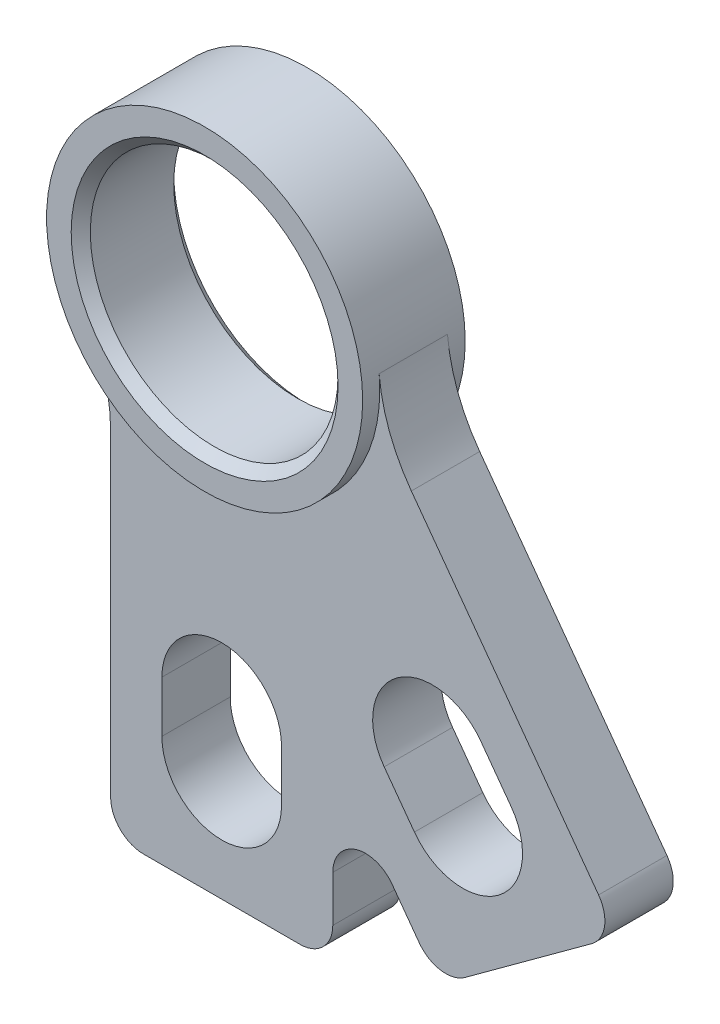
ISO-10303-21;
HEADER;
FILE_DESCRIPTION(('STEP AP214'),'2;1');
FILE_NAME('part.step','',(''),(''),'','','');
FILE_SCHEMA(('AUTOMOTIVE_DESIGN { 1 0 10303 214 1 1 1 1 }'));
ENDSEC;
DATA;
#1=APPLICATION_CONTEXT('core data for automotive mechanical design processes');
#2=APPLICATION_PROTOCOL_DEFINITION('international standard','automotive_design',2000,#1);
#3=PRODUCT_CONTEXT('',#1,'mechanical');
#4=PRODUCT('Part','Part','',(#3));
#5=PRODUCT_RELATED_PRODUCT_CATEGORY('part','',(#4));
#6=PRODUCT_DEFINITION_FORMATION('','',#4);
#7=PRODUCT_DEFINITION_CONTEXT('part definition',#1,'design');
#8=PRODUCT_DEFINITION('design','',#6,#7);
#9=PRODUCT_DEFINITION_SHAPE('','',#8);
#10=(LENGTH_UNIT() NAMED_UNIT(*) SI_UNIT(.MILLI.,.METRE.));
#11=(NAMED_UNIT(*) PLANE_ANGLE_UNIT() SI_UNIT($,.RADIAN.));
#12=(NAMED_UNIT(*) SI_UNIT($,.STERADIAN.) SOLID_ANGLE_UNIT());
#13=UNCERTAINTY_MEASURE_WITH_UNIT(LENGTH_MEASURE(1.E-05),#10,'distance_accuracy_value','');
#14=(GEOMETRIC_REPRESENTATION_CONTEXT(3) GLOBAL_UNCERTAINTY_ASSIGNED_CONTEXT((#13)) GLOBAL_UNIT_ASSIGNED_CONTEXT((#10,
#11,#12)) REPRESENTATION_CONTEXT('',''));
#15=CARTESIAN_POINT('',(0.,0.,0.));
#16=DIRECTION('',(0.,0.,1.));
#17=DIRECTION('',(1.,0.,0.));
#18=AXIS2_PLACEMENT_3D('',#15,#16,#17);
#19=CARTESIAN_POINT('',(0.,0.,4.7625));
#20=DIRECTION('',(0.,0.,-1.));
#21=DIRECTION('',(-1.,0.,0.));
#22=AXIS2_PLACEMENT_3D('',#19,#20,#21);
#23=CYLINDRICAL_SURFACE('',#22,11.5062);
#24=CARTESIAN_POINT('',(0.,0.,-3.87350000000004));
#25=DIRECTION('',(0.,0.,1.));
#26=DIRECTION('',(1.,0.,0.));
#27=AXIS2_PLACEMENT_3D('',#24,#25,#26);
#28=CIRCLE('',#27,11.5062);
#29=CARTESIAN_POINT('',(-11.5062,0.,-3.87350000000004));
#30=VERTEX_POINT('',#29);
#31=EDGE_CURVE('E60',#30,#30,#28,.F.);
#32=CARTESIAN_POINT('',(0.,0.,3.87349999999998));
#33=DIRECTION('',(0.,0.,1.));
#34=DIRECTION('',(1.,0.,0.));
#35=AXIS2_PLACEMENT_3D('',#32,#33,#34);
#36=CIRCLE('',#35,11.5062);
#37=CARTESIAN_POINT('',(-11.5062,0.,3.87349999999998));
#38=VERTEX_POINT('',#37);
#39=EDGE_CURVE('E447',#38,#38,#36,.T.);
#40=CARTESIAN_POINT('',(-11.5062,0.,-3.87350000000004));
#41=CARTESIAN_POINT('',(-11.5062,0.,-3.79280208333337));
#42=CARTESIAN_POINT('',(-11.5062,0.,-3.7121041666667));
#43=CARTESIAN_POINT('',(-11.5062,0.,-3.55070833333337));
#44=CARTESIAN_POINT('',(-11.5062,0.,-3.4700104166667));
#45=CARTESIAN_POINT('',(-11.5062,0.,-3.30861458333337));
#46=CARTESIAN_POINT('',(-11.5062,0.,-3.2279166666667));
#47=CARTESIAN_POINT('',(-11.5062,0.,-3.06652083333337));
#48=CARTESIAN_POINT('',(-11.5062,0.,-2.9858229166667));
#49=CARTESIAN_POINT('',(-11.5062,0.,-2.82442708333337));
#50=CARTESIAN_POINT('',(-11.5062,0.,-2.7437291666667));
#51=CARTESIAN_POINT('',(-11.5062,0.,-2.58233333333337));
#52=CARTESIAN_POINT('',(-11.5062,0.,-2.5016354166667));
#53=CARTESIAN_POINT('',(-11.5062,0.,-2.34023958333337));
#54=CARTESIAN_POINT('',(-11.5062,0.,-2.2595416666667));
#55=CARTESIAN_POINT('',(-11.5062,0.,-2.09814583333337));
#56=CARTESIAN_POINT('',(-11.5062,0.,-2.0174479166667));
#57=CARTESIAN_POINT('',(-11.5062,0.,-1.85605208333337));
#58=CARTESIAN_POINT('',(-11.5062,0.,-1.7753541666667));
#59=CARTESIAN_POINT('',(-11.5062,0.,-1.61395833333337));
#60=CARTESIAN_POINT('',(-11.5062,0.,-1.5332604166667));
#61=CARTESIAN_POINT('',(-11.5062,0.,-1.37186458333337));
#62=CARTESIAN_POINT('',(-11.5062,0.,-1.2911666666667));
#63=CARTESIAN_POINT('',(-11.5062,0.,-1.12977083333337));
#64=CARTESIAN_POINT('',(-11.5062,0.,-1.0490729166667));
#65=CARTESIAN_POINT('',(-11.5062,0.,-0.887677083333366));
#66=CARTESIAN_POINT('',(-11.5062,0.,-0.806979166666699));
#67=CARTESIAN_POINT('',(-11.5062,0.,-0.645583333333365));
#68=CARTESIAN_POINT('',(-11.5062,0.,-0.564885416666698));
#69=CARTESIAN_POINT('',(-11.5062,0.,-0.403489583333365));
#70=CARTESIAN_POINT('',(-11.5062,0.,-0.322791666666698));
#71=CARTESIAN_POINT('',(-11.5062,0.,-0.161395833333364));
#72=CARTESIAN_POINT('',(-11.5062,0.,-0.0806979166666974));
#73=CARTESIAN_POINT('',(-11.5062,0.,0.0806979166666364));
#74=CARTESIAN_POINT('',(-11.5062,0.,0.161395833333303));
#75=CARTESIAN_POINT('',(-11.5062,0.,0.322791666666637));
#76=CARTESIAN_POINT('',(-11.5062,0.,0.403489583333304));
#77=CARTESIAN_POINT('',(-11.5062,0.,0.564885416666637));
#78=CARTESIAN_POINT('',(-11.5062,0.,0.645583333333304));
#79=CARTESIAN_POINT('',(-11.5062,0.,0.806979166666638));
#80=CARTESIAN_POINT('',(-11.5062,0.,0.887677083333305));
#81=CARTESIAN_POINT('',(-11.5062,0.,1.04907291666664));
#82=CARTESIAN_POINT('',(-11.5062,0.,1.1297708333333));
#83=CARTESIAN_POINT('',(-11.5062,0.,1.29116666666664));
#84=CARTESIAN_POINT('',(-11.5062,0.,1.37186458333331));
#85=CARTESIAN_POINT('',(-11.5062,0.,1.53326041666664));
#86=CARTESIAN_POINT('',(-11.5062,0.,1.61395833333331));
#87=CARTESIAN_POINT('',(-11.5062,0.,1.77535416666664));
#88=CARTESIAN_POINT('',(-11.5062,0.,1.85605208333331));
#89=CARTESIAN_POINT('',(-11.5062,0.,2.01744791666664));
#90=CARTESIAN_POINT('',(-11.5062,0.,2.09814583333331));
#91=CARTESIAN_POINT('',(-11.5062,0.,2.25954166666664));
#92=CARTESIAN_POINT('',(-11.5062,0.,2.34023958333331));
#93=CARTESIAN_POINT('',(-11.5062,0.,2.50163541666664));
#94=CARTESIAN_POINT('',(-11.5062,0.,2.58233333333331));
#95=CARTESIAN_POINT('',(-11.5062,0.,2.74372916666664));
#96=CARTESIAN_POINT('',(-11.5062,0.,2.82442708333331));
#97=CARTESIAN_POINT('',(-11.5062,0.,2.98582291666664));
#98=CARTESIAN_POINT('',(-11.5062,0.,3.06652083333331));
#99=CARTESIAN_POINT('',(-11.5062,0.,3.22791666666664));
#100=CARTESIAN_POINT('',(-11.5062,0.,3.30861458333331));
#101=CARTESIAN_POINT('',(-11.5062,0.,3.47001041666664));
#102=CARTESIAN_POINT('',(-11.5062,0.,3.55070833333331));
#103=CARTESIAN_POINT('',(-11.5062,0.,3.71210416666664));
#104=CARTESIAN_POINT('',(-11.5062,0.,3.79280208333331));
#105=CARTESIAN_POINT('',(-11.5062,0.,3.87349999999998));
#106=B_SPLINE_CURVE_WITH_KNOTS('',3,(#40,#41,#42,#43,#44,#45,#46,#47,#48,#49,#50,#51,#52,#53,
#54,#55,#56,#57,#58,#59,#60,#61,#62,#63,#64,#65,#66,#67,#68,#69,#70,#71,#72,#73,#74,#75,#76,#77,
#78,#79,#80,#81,#82,#83,#84,#85,#86,#87,#88,#89,#90,#91,#92,#93,#94,#95,#96,#97,#98,#99,#100,
#101,#102,#103,#104,#105),.UNSPECIFIED.,.F.,.F.,(4,2,2,2,2,2,2,2,2,2,2,2,2,2,2,2,2,2,2,2,2,2,2,
2,2,2,2,2,2,2,2,2,4),(0.,0.24209375,0.4841875,0.726281250000002,0.968375000000001,1.21046875,
1.4525625,1.69465625,1.93675,2.17884375,2.4209375,2.66303125,2.905125,3.14721875000001,
3.38931250000001,3.63140625000001,3.87350000000001,4.11559375000001,4.35768750000001,
4.59978125000001,4.84187500000001,5.08396875000001,5.32606250000001,5.56815625000001,
5.81025000000001,6.05234375000001,6.29443750000001,6.53653125000001,6.77862500000001,
7.02071875000001,7.26281250000001,7.50490625000001,7.74700000000001),.UNSPECIFIED.);
#107=EDGE_CURVE('BSEAM51',#30,#38,#106,.T.);
#108=ORIENTED_EDGE('',*,*,#31,.T.);
#109=ORIENTED_EDGE('',*,*,#39,.T.);
#110=ORIENTED_EDGE('',*,*,#107,.T.);
#111=ORIENTED_EDGE('',*,*,#107,.F.);
#112=EDGE_LOOP('',(#108,#110,#109,#111));
#113=FACE_BOUND('',#112,.T.);
#114=ADVANCED_FACE('F51',(#113),#23,.F.);
#115=CARTESIAN_POINT('',(0.,0.,4.7625));
#116=DIRECTION('',(0.,0.,-1.));
#117=DIRECTION('',(-1.,0.,0.));
#118=AXIS2_PLACEMENT_3D('',#115,#116,#117);
#119=CYLINDRICAL_SURFACE('',#118,14.6812);
#120=DIRECTION('',(0.,0.,-1.));
#121=VECTOR('',#120,1.);
#122=CARTESIAN_POINT('',(-12.585193266832,-7.55979787272687,3.175));
#123=LINE('',#122,#121);
#124=CARTESIAN_POINT('',(-12.585193266832,-7.55979787272688,3.175));
#125=VERTEX_POINT('',#124);
#126=CARTESIAN_POINT('',(-12.585193266832,-7.55979787272687,-3.175));
#127=VERTEX_POINT('',#126);
#128=EDGE_CURVE('E215',#125,#127,#123,.T.);
#129=ORIENTED_EDGE('',*,*,#128,.F.);
#130=CARTESIAN_POINT('',(0.,0.,3.175));
#131=DIRECTION('',(0.,0.,1.));
#132=DIRECTION('',(1.,0.,0.));
#133=AXIS2_PLACEMENT_3D('',#130,#131,#132);
#134=CIRCLE('',#133,14.6812);
#135=CARTESIAN_POINT('',(14.6214976963152,1.32266343286804,3.175));
#136=VERTEX_POINT('',#135);
#137=EDGE_CURVE('E232',#125,#136,#134,.T.);
#138=ORIENTED_EDGE('',*,*,#137,.T.);
#139=DIRECTION('',(0.,0.,-1.));
#140=VECTOR('',#139,1.);
#141=CARTESIAN_POINT('',(14.6214976963153,1.32266343286796,3.175));
#142=LINE('',#141,#140);
#143=CARTESIAN_POINT('',(14.6214976963153,1.32266343286796,-3.175));
#144=VERTEX_POINT('',#143);
#145=EDGE_CURVE('E289',#136,#144,#142,.T.);
#146=ORIENTED_EDGE('',*,*,#145,.T.);
#147=CARTESIAN_POINT('',(0.,0.,-3.175));
#148=DIRECTION('',(0.,0.,1.));
#149=DIRECTION('',(1.,0.,0.));
#150=AXIS2_PLACEMENT_3D('',#147,#148,#149);
#151=CIRCLE('',#150,14.6812);
#152=EDGE_CURVE('E290',#127,#144,#151,.T.);
#153=ORIENTED_EDGE('',*,*,#152,.F.);
#154=EDGE_LOOP('',(#129,#138,#146,#153));
#155=FACE_BOUND('',#154,.T.);
#156=CARTESIAN_POINT('',(0.,0.,4.7625));
#157=DIRECTION('',(0.,0.,1.));
#158=DIRECTION('',(1.,0.,0.));
#159=AXIS2_PLACEMENT_3D('',#156,#157,#158);
#160=CIRCLE('',#159,14.6812);
#161=CARTESIAN_POINT('',(14.6812,0.,4.7625));
#162=VERTEX_POINT('',#161);
#163=EDGE_CURVE('E374',#162,#162,#160,.T.);
#164=ORIENTED_EDGE('',*,*,#163,.F.);
#165=EDGE_LOOP('',(#164));
#166=FACE_BOUND('',#165,.T.);
#167=CARTESIAN_POINT('',(0.,0.,-4.7625));
#168=DIRECTION('',(0.,0.,1.));
#169=DIRECTION('',(1.,0.,0.));
#170=AXIS2_PLACEMENT_3D('',#167,#168,#169);
#171=CIRCLE('',#170,14.6812);
#172=CARTESIAN_POINT('',(14.6812,0.,-4.7625));
#173=VERTEX_POINT('',#172);
#174=EDGE_CURVE('E355',#173,#173,#171,.T.);
#175=ORIENTED_EDGE('',*,*,#174,.T.);
#176=EDGE_LOOP('',(#175));
#177=FACE_BOUND('',#176,.T.);
#178=ADVANCED_FACE('F471',(#155,#166,#177),#119,.T.);
#179=CARTESIAN_POINT('',(0.,0.,4.7625));
#180=DIRECTION('',(0.,0.,1.));
#181=DIRECTION('',(1.,0.,0.));
#182=AXIS2_PLACEMENT_3D('',#179,#180,#181);
#183=PLANE('',#182);
#184=CARTESIAN_POINT('',(0.,0.,4.7625));
#185=DIRECTION('',(0.,0.,1.));
#186=DIRECTION('',(1.,0.,0.));
#187=AXIS2_PLACEMENT_3D('',#184,#185,#186);
#188=CIRCLE('',#187,12.3952);
#189=CARTESIAN_POINT('',(12.3952,0.,4.7625));
#190=VERTEX_POINT('',#189);
#191=EDGE_CURVE('E12',#190,#190,#188,.F.);
#192=ORIENTED_EDGE('',*,*,#191,.T.);
#193=EDGE_LOOP('',(#192));
#194=FACE_BOUND('',#193,.T.);
#195=ORIENTED_EDGE('',*,*,#163,.T.);
#196=EDGE_LOOP('',(#195));
#197=FACE_BOUND('',#196,.T.);
#198=ADVANCED_FACE('F467',(#194,#197),#183,.T.);
#199=CARTESIAN_POINT('',(0.,0.,-4.7625));
#200=DIRECTION('',(0.,0.,1.));
#201=DIRECTION('',(1.,0.,0.));
#202=AXIS2_PLACEMENT_3D('',#199,#200,#201);
#203=PLANE('',#202);
#204=CARTESIAN_POINT('',(0.,0.,-4.7625));
#205=DIRECTION('',(0.,0.,1.));
#206=DIRECTION('',(1.,0.,0.));
#207=AXIS2_PLACEMENT_3D('',#204,#205,#206);
#208=CIRCLE('',#207,12.3952);
#209=CARTESIAN_POINT('',(12.3952,0.,-4.7625));
#210=VERTEX_POINT('',#209);
#211=EDGE_CURVE('E442',#210,#210,#208,.T.);
#212=ORIENTED_EDGE('',*,*,#211,.T.);
#213=EDGE_LOOP('',(#212));
#214=FACE_BOUND('',#213,.T.);
#215=ORIENTED_EDGE('',*,*,#174,.F.);
#216=EDGE_LOOP('',(#215));
#217=FACE_BOUND('',#216,.T.);
#218=ADVANCED_FACE('F463',(#214,#217),#203,.F.);
#219=CARTESIAN_POINT('',(0.,-33.1787499999983,3.175));
#220=DIRECTION('',(0.,0.,-1.));
#221=DIRECTION('',(-1.,0.,0.));
#222=AXIS2_PLACEMENT_3D('',#219,#220,#221);
#223=CYLINDRICAL_SURFACE('',#222,5.55624999999838);
#224=CARTESIAN_POINT('',(0.,-33.1787499999983,-3.175));
#225=DIRECTION('',(0.,0.,1.));
#226=DIRECTION('',(1.,0.,0.));
#227=AXIS2_PLACEMENT_3D('',#224,#225,#226);
#228=CIRCLE('',#227,5.55624999999838);
#229=CARTESIAN_POINT('',(5.55624999999832,-33.1787499999983,-3.175));
#230=VERTEX_POINT('',#229);
#231=CARTESIAN_POINT('',(-5.55624999999843,-33.1787499999983,-3.175));
#232=VERTEX_POINT('',#231);
#233=EDGE_CURVE('E327',#230,#232,#228,.T.);
#234=ORIENTED_EDGE('',*,*,#233,.F.);
#235=DIRECTION('',(0.,0.,-1.));
#236=VECTOR('',#235,1.);
#237=CARTESIAN_POINT('',(5.55624999999832,-33.1787499999983,3.175));
#238=LINE('',#237,#236);
#239=CARTESIAN_POINT('',(5.55624999999832,-33.1787499999983,3.175));
#240=VERTEX_POINT('',#239);
#241=EDGE_CURVE('E352',#240,#230,#238,.T.);
#242=ORIENTED_EDGE('',*,*,#241,.F.);
#243=CARTESIAN_POINT('',(0.,-33.1787499999983,3.175));
#244=DIRECTION('',(0.,0.,1.));
#245=DIRECTION('',(1.,0.,0.));
#246=AXIS2_PLACEMENT_3D('',#243,#244,#245);
#247=CIRCLE('',#246,5.55624999999838);
#248=CARTESIAN_POINT('',(-5.55624999999843,-33.1787499999983,3.175));
#249=VERTEX_POINT('',#248);
#250=EDGE_CURVE('E274',#240,#249,#247,.T.);
#251=ORIENTED_EDGE('',*,*,#250,.T.);
#252=DIRECTION('',(0.,0.,-1.));
#253=VECTOR('',#252,1.);
#254=CARTESIAN_POINT('',(-5.55624999999843,-33.1787499999983,3.175));
#255=LINE('',#254,#253);
#256=EDGE_CURVE('E342',#249,#232,#255,.T.);
#257=ORIENTED_EDGE('',*,*,#256,.T.);
#258=EDGE_LOOP('',(#234,#242,#251,#257));
#259=FACE_BOUND('',#258,.T.);
#260=ADVANCED_FACE('F466',(#259),#223,.F.);
#261=CARTESIAN_POINT('',(5.55624999999833,0.,3.175));
#262=DIRECTION('',(-1.,0.,0.));
#263=DIRECTION('',(0.,-1.,0.));
#264=AXIS2_PLACEMENT_3D('',#261,#262,#263);
#265=PLANE('',#264);
#266=DIRECTION('',(0.,1.,0.));
#267=VECTOR('',#266,1.);
#268=CARTESIAN_POINT('',(5.55624999999833,0.,-3.175));
#269=LINE('',#268,#267);
#270=CARTESIAN_POINT('',(5.55624999999832,-37.9412500000015,-3.175));
#271=VERTEX_POINT('',#270);
#272=EDGE_CURVE('E331',#271,#230,#269,.T.);
#273=ORIENTED_EDGE('',*,*,#272,.F.);
#274=DIRECTION('',(0.,0.,-1.));
#275=VECTOR('',#274,1.);
#276=CARTESIAN_POINT('',(5.55624999999832,-37.9412500000015,3.175));
#277=LINE('',#276,#275);
#278=CARTESIAN_POINT('',(5.55624999999832,-37.9412500000015,3.175));
#279=VERTEX_POINT('',#278);
#280=EDGE_CURVE('E349',#279,#271,#277,.T.);
#281=ORIENTED_EDGE('',*,*,#280,.F.);
#282=DIRECTION('',(0.,1.,0.));
#283=VECTOR('',#282,1.);
#284=CARTESIAN_POINT('',(5.55624999999833,0.,3.175));
#285=LINE('',#284,#283);
#286=EDGE_CURVE('E278',#279,#240,#285,.T.);
#287=ORIENTED_EDGE('',*,*,#286,.T.);
#288=ORIENTED_EDGE('',*,*,#241,.T.);
#289=EDGE_LOOP('',(#273,#281,#287,#288));
#290=FACE_BOUND('',#289,.T.);
#291=ADVANCED_FACE('F782',(#290),#265,.T.);
#292=CARTESIAN_POINT('',(0.,-37.9412500000015,3.175));
#293=DIRECTION('',(0.,0.,-1.));
#294=DIRECTION('',(-1.,0.,0.));
#295=AXIS2_PLACEMENT_3D('',#292,#293,#294);
#296=CYLINDRICAL_SURFACE('',#295,5.55624999999838);
#297=CARTESIAN_POINT('',(0.,-37.9412500000015,-3.175));
#298=DIRECTION('',(0.,0.,1.));
#299=DIRECTION('',(1.,0.,0.));
#300=AXIS2_PLACEMENT_3D('',#297,#298,#299);
#301=CIRCLE('',#300,5.55624999999838);
#302=CARTESIAN_POINT('',(-5.55624999999843,-37.9412500000015,-3.175));
#303=VERTEX_POINT('',#302);
#304=EDGE_CURVE('E335',#303,#271,#301,.T.);
#305=ORIENTED_EDGE('',*,*,#304,.F.);
#306=DIRECTION('',(0.,0.,-1.));
#307=VECTOR('',#306,1.);
#308=CARTESIAN_POINT('',(-5.55624999999843,-37.9412500000015,3.175));
#309=LINE('',#308,#307);
#310=CARTESIAN_POINT('',(-5.55624999999843,-37.9412500000015,3.175));
#311=VERTEX_POINT('',#310);
#312=EDGE_CURVE('E345',#311,#303,#309,.T.);
#313=ORIENTED_EDGE('',*,*,#312,.F.);
#314=CARTESIAN_POINT('',(0.,-37.9412500000015,3.175));
#315=DIRECTION('',(0.,0.,1.));
#316=DIRECTION('',(1.,0.,0.));
#317=AXIS2_PLACEMENT_3D('',#314,#315,#316);
#318=CIRCLE('',#317,5.55624999999838);
#319=EDGE_CURVE('E282',#311,#279,#318,.T.);
#320=ORIENTED_EDGE('',*,*,#319,.T.);
#321=ORIENTED_EDGE('',*,*,#280,.T.);
#322=EDGE_LOOP('',(#305,#313,#320,#321));
#323=FACE_BOUND('',#322,.T.);
#324=ADVANCED_FACE('F595',(#323),#296,.F.);
#325=CARTESIAN_POINT('',(19.577669676264,-26.7870174078692,3.175));
#326=DIRECTION('',(0.,0.,-1.));
#327=DIRECTION('',(-1.,0.,0.));
#328=AXIS2_PLACEMENT_3D('',#325,#326,#327);
#329=CYLINDRICAL_SURFACE('',#328,5.5562499999983);
#330=CARTESIAN_POINT('',(19.577669676264,-26.7870174078692,-3.175));
#331=DIRECTION('',(0.,0.,1.));
#332=DIRECTION('',(1.,0.,0.));
#333=AXIS2_PLACEMENT_3D('',#330,#331,#332);
#334=CIRCLE('',#333,5.5562499999983);
#335=CARTESIAN_POINT('',(24.0635338354753,-23.5084602850507,-3.175));
#336=VERTEX_POINT('',#335);
#337=CARTESIAN_POINT('',(15.0918055170525,-30.0655745306877,-3.175));
#338=VERTEX_POINT('',#337);
#339=EDGE_CURVE('E311',#336,#338,#334,.T.);
#340=ORIENTED_EDGE('',*,*,#339,.F.);
#341=DIRECTION('',(0.,0.,-1.));
#342=VECTOR('',#341,1.);
#343=CARTESIAN_POINT('',(24.0635338354753,-23.5084602850507,3.175));
#344=LINE('',#343,#342);
#345=CARTESIAN_POINT('',(24.0635338354753,-23.5084602850507,3.175));
#346=VERTEX_POINT('',#345);
#347=EDGE_CURVE('E346',#346,#336,#344,.T.);
#348=ORIENTED_EDGE('',*,*,#347,.F.);
#349=CARTESIAN_POINT('',(19.577669676264,-26.7870174078692,3.175));
#350=DIRECTION('',(0.,0.,1.));
#351=DIRECTION('',(1.,0.,0.));
#352=AXIS2_PLACEMENT_3D('',#349,#350,#351);
#353=CIRCLE('',#352,5.5562499999983);
#354=CARTESIAN_POINT('',(15.0918055170525,-30.0655745306877,3.175));
#355=VERTEX_POINT('',#354);
#356=EDGE_CURVE('E259',#346,#355,#353,.T.);
#357=ORIENTED_EDGE('',*,*,#356,.T.);
#358=DIRECTION('',(0.,0.,-1.));
#359=VECTOR('',#358,1.);
#360=CARTESIAN_POINT('',(15.0918055170525,-30.0655745306877,3.175));
#361=LINE('',#360,#359);
#362=EDGE_CURVE('E356',#355,#338,#361,.T.);
#363=ORIENTED_EDGE('',*,*,#362,.T.);
#364=EDGE_LOOP('',(#340,#348,#357,#363));
#365=FACE_BOUND('',#364,.T.);
#366=ADVANCED_FACE('F585',(#365),#329,.F.);
#367=CARTESIAN_POINT('',(4.4858641592114,3.27855712281848,3.175));
#368=DIRECTION('',(-0.807354629329632,-0.590066523792032,0.));
#369=DIRECTION('',(0.590066523792032,-0.807354629329632,0.));
#370=AXIS2_PLACEMENT_3D('',#367,#368,#369);
#371=PLANE('',#370);
#372=DIRECTION('',(-0.590066523792032,0.807354629329632,0.));
#373=VECTOR('',#372,1.);
#374=CARTESIAN_POINT('',(4.4858641592114,3.27855712281848,-3.175));
#375=LINE('',#374,#373);
#376=CARTESIAN_POINT('',(26.8737256550367,-27.3534867072357,-3.175));
#377=VERTEX_POINT('',#376);
#378=EDGE_CURVE('E315',#377,#336,#375,.T.);
#379=ORIENTED_EDGE('',*,*,#378,.F.);
#380=DIRECTION('',(0.,0.,-1.));
#381=VECTOR('',#380,1.);
#382=CARTESIAN_POINT('',(26.8737256550367,-27.3534867072357,3.175));
#383=LINE('',#382,#381);
#384=CARTESIAN_POINT('',(26.8737256550367,-27.3534867072357,3.175));
#385=VERTEX_POINT('',#384);
#386=EDGE_CURVE('E362',#385,#377,#383,.T.);
#387=ORIENTED_EDGE('',*,*,#386,.F.);
#388=DIRECTION('',(-0.590066523792032,0.807354629329632,0.));
#389=VECTOR('',#388,1.);
#390=CARTESIAN_POINT('',(4.4858641592114,3.27855712281848,3.175));
#391=LINE('',#390,#389);
#392=EDGE_CURVE('E263',#385,#346,#391,.T.);
#393=ORIENTED_EDGE('',*,*,#392,.T.);
#394=ORIENTED_EDGE('',*,*,#347,.T.);
#395=EDGE_LOOP('',(#379,#387,#393,#394));
#396=FACE_BOUND('',#395,.T.);
#397=ADVANCED_FACE('F579',(#396),#371,.T.);
#398=CARTESIAN_POINT('',(22.3878614958254,-30.6320438300541,3.175));
#399=DIRECTION('',(0.,0.,-1.));
#400=DIRECTION('',(-1.,0.,0.));
#401=AXIS2_PLACEMENT_3D('',#398,#399,#400);
#402=CYLINDRICAL_SURFACE('',#401,5.5562499999983);
#403=CARTESIAN_POINT('',(22.3878614958254,-30.6320438300541,-3.175));
#404=DIRECTION('',(0.,0.,1.));
#405=DIRECTION('',(1.,0.,0.));
#406=AXIS2_PLACEMENT_3D('',#403,#404,#405);
#407=CIRCLE('',#406,5.5562499999983);
#408=CARTESIAN_POINT('',(17.901997336614,-33.9106009528726,-3.175));
#409=VERTEX_POINT('',#408);
#410=EDGE_CURVE('E319',#409,#377,#407,.T.);
#411=ORIENTED_EDGE('',*,*,#410,.F.);
#412=DIRECTION('',(0.,0.,-1.));
#413=VECTOR('',#412,1.);
#414=CARTESIAN_POINT('',(17.901997336614,-33.9106009528726,3.175));
#415=LINE('',#414,#413);
#416=CARTESIAN_POINT('',(17.901997336614,-33.9106009528726,3.175));
#417=VERTEX_POINT('',#416);
#418=EDGE_CURVE('E359',#417,#409,#415,.T.);
#419=ORIENTED_EDGE('',*,*,#418,.F.);
#420=CARTESIAN_POINT('',(22.3878614958254,-30.6320438300541,3.175));
#421=DIRECTION('',(0.,0.,1.));
#422=DIRECTION('',(1.,0.,0.));
#423=AXIS2_PLACEMENT_3D('',#420,#421,#422);
#424=CIRCLE('',#423,5.5562499999983);
#425=EDGE_CURVE('E267',#417,#385,#424,.T.);
#426=ORIENTED_EDGE('',*,*,#425,.T.);
#427=ORIENTED_EDGE('',*,*,#386,.T.);
#428=EDGE_LOOP('',(#411,#419,#426,#427));
#429=FACE_BOUND('',#428,.T.);
#430=ADVANCED_FACE('F575',(#429),#402,.F.);
#431=CARTESIAN_POINT('',(-26.1937499999968,-15.7343197939273,3.175));
#432=DIRECTION('',(0.,0.,-1.));
#433=DIRECTION('',(-1.,0.,0.));
#434=AXIS2_PLACEMENT_3D('',#431,#432,#433);
#435=CYLINDRICAL_SURFACE('',#434,15.8749999999984);
#436=CARTESIAN_POINT('',(-26.1937499999968,-15.7343197939273,-3.175));
#437=DIRECTION('',(0.,0.,1.));
#438=DIRECTION('',(1.,0.,0.));
#439=AXIS2_PLACEMENT_3D('',#436,#437,#438);
#440=CIRCLE('',#439,15.8749999999984);
#441=CARTESIAN_POINT('',(-10.3187499999984,-15.7343197939273,-3.175));
#442=VERTEX_POINT('',#441);
#443=EDGE_CURVE('E210',#442,#127,#440,.T.);
#444=ORIENTED_EDGE('',*,*,#443,.F.);
#445=DIRECTION('',(0.,0.,-1.));
#446=VECTOR('',#445,1.);
#447=CARTESIAN_POINT('',(-10.3187499999984,-15.7343197939273,3.175));
#448=LINE('',#447,#446);
#449=CARTESIAN_POINT('',(-10.3187499999984,-15.7343197939273,3.175));
#450=VERTEX_POINT('',#449);
#451=EDGE_CURVE('E203',#450,#442,#448,.T.);
#452=ORIENTED_EDGE('',*,*,#451,.F.);
#453=CARTESIAN_POINT('',(-26.1937499999968,-15.7343197939273,3.175));
#454=DIRECTION('',(0.,0.,1.));
#455=DIRECTION('',(1.,0.,0.));
#456=AXIS2_PLACEMENT_3D('',#453,#454,#455);
#457=CIRCLE('',#456,15.8749999999984);
#458=EDGE_CURVE('E208',#450,#125,#457,.T.);
#459=ORIENTED_EDGE('',*,*,#458,.T.);
#460=ORIENTED_EDGE('',*,*,#128,.T.);
#461=EDGE_LOOP('',(#444,#452,#459,#460));
#462=FACE_BOUND('',#461,.T.);
#463=ADVANCED_FACE('F205',(#462),#435,.F.);
#464=CARTESIAN_POINT('',(-10.3187499999983,0.,3.175));
#465=DIRECTION('',(1.,0.,0.));
#466=DIRECTION('',(0.,1.,0.));
#467=AXIS2_PLACEMENT_3D('',#464,#465,#466);
#468=PLANE('',#467);
#469=DIRECTION('',(0.,-1.,0.));
#470=VECTOR('',#469,1.);
#471=CARTESIAN_POINT('',(-10.3187499999983,0.,-3.175));
#472=LINE('',#471,#470);
#473=CARTESIAN_POINT('',(-10.3187499999984,-45.2119999999998,-3.175));
#474=VERTEX_POINT('',#473);
#475=EDGE_CURVE('E521',#442,#474,#472,.T.);
#476=ORIENTED_EDGE('',*,*,#475,.T.);
#477=DIRECTION('',(0.,0.,-1.));
#478=VECTOR('',#477,1.);
#479=CARTESIAN_POINT('',(-10.3187499999984,-45.2119999999998,3.175));
#480=LINE('',#479,#478);
#481=CARTESIAN_POINT('',(-10.3187499999984,-45.2119999999998,3.175));
#482=VERTEX_POINT('',#481);
#483=EDGE_CURVE('E222',#474,#482,#480,.F.);
#484=ORIENTED_EDGE('',*,*,#483,.T.);
#485=DIRECTION('',(0.,-1.,0.));
#486=VECTOR('',#485,1.);
#487=CARTESIAN_POINT('',(-10.3187499999983,0.,3.175));
#488=LINE('',#487,#486);
#489=EDGE_CURVE('E219',#450,#482,#488,.T.);
#490=ORIENTED_EDGE('',*,*,#489,.F.);
#491=ORIENTED_EDGE('',*,*,#451,.T.);
#492=EDGE_LOOP('',(#476,#484,#490,#491));
#493=FACE_BOUND('',#492,.T.);
#494=ADVANCED_FACE('F220',(#493),#468,.F.);
#495=CARTESIAN_POINT('',(-2.92074057247586E-13,-48.2599999999998,3.175));
#496=DIRECTION('',(0.,1.,0.));
#497=DIRECTION('',(-1.,0.,0.));
#498=AXIS2_PLACEMENT_3D('',#495,#496,#497);
#499=PLANE('',#498);
#500=DIRECTION('',(1.,0.,0.));
#501=VECTOR('',#500,1.);
#502=CARTESIAN_POINT('',(-2.92074057247586E-13,-48.2599999999998,-3.175));
#503=LINE('',#502,#501);
#504=CARTESIAN_POINT('',(-7.27074999999845,-48.2599999999998,-3.175));
#505=VERTEX_POINT('',#504);
#506=CARTESIAN_POINT('',(7.27074999999832,-48.2599999999999,-3.175));
#507=VERTEX_POINT('',#506);
#508=EDGE_CURVE('E526',#505,#507,#503,.T.);
#509=ORIENTED_EDGE('',*,*,#508,.T.);
#510=DIRECTION('',(0.,0.,-1.));
#511=VECTOR('',#510,1.);
#512=CARTESIAN_POINT('',(7.27074999999832,-48.2599999999999,3.175));
#513=LINE('',#512,#511);
#514=CARTESIAN_POINT('',(7.27074999999832,-48.2599999999999,3.175));
#515=VERTEX_POINT('',#514);
#516=EDGE_CURVE('E411',#507,#515,#513,.F.);
#517=ORIENTED_EDGE('',*,*,#516,.T.);
#518=DIRECTION('',(1.,0.,0.));
#519=VECTOR('',#518,1.);
#520=CARTESIAN_POINT('',(-2.92074057247586E-13,-48.2599999999998,3.175));
#521=LINE('',#520,#519);
#522=CARTESIAN_POINT('',(-7.27074999999845,-48.2599999999998,3.175));
#523=VERTEX_POINT('',#522);
#524=EDGE_CURVE('E225',#523,#515,#521,.T.);
#525=ORIENTED_EDGE('',*,*,#524,.F.);
#526=DIRECTION('',(0.,0.,-1.));
#527=VECTOR('',#526,1.);
#528=CARTESIAN_POINT('',(-7.27074999999845,-48.2599999999998,3.175));
#529=LINE('',#528,#527);
#530=EDGE_CURVE('E407',#523,#505,#529,.T.);
#531=ORIENTED_EDGE('',*,*,#530,.T.);
#532=EDGE_LOOP('',(#509,#517,#525,#531));
#533=FACE_BOUND('',#532,.T.);
#534=ADVANCED_FACE('F561',(#533),#499,.F.);
#535=CARTESIAN_POINT('',(10.3187499999982,0.,3.175));
#536=DIRECTION('',(-1.,0.,0.));
#537=DIRECTION('',(0.,-1.,0.));
#538=AXIS2_PLACEMENT_3D('',#535,#536,#537);
#539=PLANE('',#538);
#540=DIRECTION('',(0.,1.,0.));
#541=VECTOR('',#540,1.);
#542=CARTESIAN_POINT('',(10.3187499999982,0.,-3.175));
#543=LINE('',#542,#541);
#544=CARTESIAN_POINT('',(10.3187499999983,-45.2119999999999,-3.175));
#545=VERTEX_POINT('',#544);
#546=CARTESIAN_POINT('',(10.3187499999983,-40.9419218299925,-3.175));
#547=VERTEX_POINT('',#546);
#548=EDGE_CURVE('E530',#545,#547,#543,.T.);
#549=ORIENTED_EDGE('',*,*,#548,.T.);
#550=DIRECTION('',(0.,0.,-1.));
#551=VECTOR('',#550,1.);
#552=CARTESIAN_POINT('',(10.3187499999983,-40.9419218299925,3.175));
#553=LINE('',#552,#551);
#554=CARTESIAN_POINT('',(10.3187499999983,-40.9419218299925,3.175));
#555=VERTEX_POINT('',#554);
#556=EDGE_CURVE('E392',#547,#555,#553,.F.);
#557=ORIENTED_EDGE('',*,*,#556,.T.);
#558=DIRECTION('',(0.,1.,0.));
#559=VECTOR('',#558,1.);
#560=CARTESIAN_POINT('',(10.3187499999982,0.,3.175));
#561=LINE('',#560,#559);
#562=CARTESIAN_POINT('',(10.3187499999983,-45.2119999999999,3.175));
#563=VERTEX_POINT('',#562);
#564=EDGE_CURVE('E242',#563,#555,#561,.T.);
#565=ORIENTED_EDGE('',*,*,#564,.F.);
#566=DIRECTION('',(0.,0.,-1.));
#567=VECTOR('',#566,1.);
#568=CARTESIAN_POINT('',(10.3187499999983,-45.2119999999999,3.175));
#569=LINE('',#568,#567);
#570=EDGE_CURVE('E388',#563,#545,#569,.T.);
#571=ORIENTED_EDGE('',*,*,#570,.T.);
#572=EDGE_LOOP('',(#549,#557,#565,#571));
#573=FACE_BOUND('',#572,.T.);
#574=ADVANCED_FACE('F554',(#573),#539,.F.);
#575=CARTESIAN_POINT('',(-8.33089058139375,-6.08874894237801,3.175));
#576=DIRECTION('',(-0.807354629329632,-0.590066523792032,0.));
#577=DIRECTION('',(0.590066523792032,-0.807354629329632,0.));
#578=AXIS2_PLACEMENT_3D('',#575,#576,#577);
#579=PLANE('',#578);
#580=DIRECTION('',(-0.590066523792032,0.807354629329632,0.));
#581=VECTOR('',#580,1.);
#582=CARTESIAN_POINT('',(-8.33089058139375,-6.08874894237801,3.175));
#583=LINE('',#582,#581);
#584=CARTESIAN_POINT('',(18.3471970922916,-42.5908664436293,3.175));
#585=VERTEX_POINT('',#584);
#586=CARTESIAN_POINT('',(15.827566910195,-39.1433990654744,3.175));
#587=VERTEX_POINT('',#586);
#588=EDGE_CURVE('E246',#585,#587,#583,.T.);
#589=ORIENTED_EDGE('',*,*,#588,.T.);
#590=DIRECTION('',(0.,0.,-1.));
#591=VECTOR('',#590,1.);
#592=CARTESIAN_POINT('',(15.827566910195,-39.1433990654744,3.175));
#593=LINE('',#592,#591);
#594=CARTESIAN_POINT('',(15.827566910195,-39.1433990654744,-3.175));
#595=VERTEX_POINT('',#594);
#596=EDGE_CURVE('E384',#587,#595,#593,.T.);
#597=ORIENTED_EDGE('',*,*,#596,.T.);
#598=DIRECTION('',(-0.590066523792032,0.807354629329632,0.));
#599=VECTOR('',#598,1.);
#600=CARTESIAN_POINT('',(-8.33089058139375,-6.08874894237801,-3.175));
#601=LINE('',#600,#599);
#602=CARTESIAN_POINT('',(18.3471970922916,-42.5908664436293,-3.175));
#603=VERTEX_POINT('',#602);
#604=EDGE_CURVE('E535',#603,#595,#601,.T.);
#605=ORIENTED_EDGE('',*,*,#604,.F.);
#606=DIRECTION('',(0.,0.,-1.));
#607=VECTOR('',#606,1.);
#608=CARTESIAN_POINT('',(18.3471970922916,-42.5908664436293,3.175));
#609=LINE('',#608,#607);
#610=EDGE_CURVE('E377',#603,#585,#609,.F.);
#611=ORIENTED_EDGE('',*,*,#610,.T.);
#612=EDGE_LOOP('',(#589,#597,#605,#611));
#613=FACE_BOUND('',#612,.T.);
#614=ADVANCED_FACE('F547',(#613),#579,.T.);
#615=CARTESIAN_POINT('',(28.4766104382034,-38.962934411448,3.175));
#616=DIRECTION('',(-0.590066523792032,0.807354629329632,0.));
#617=DIRECTION('',(-0.807354629329632,-0.590066523792032,0.));
#618=AXIS2_PLACEMENT_3D('',#615,#616,#617);
#619=PLANE('',#618);
#620=DIRECTION('',(0.807354629329632,0.590066523792032,0.));
#621=VECTOR('',#620,1.);
#622=CARTESIAN_POINT('',(28.4766104382034,-38.962934411448,3.175));
#623=LINE('',#622,#621);
#624=CARTESIAN_POINT('',(22.6065367670064,-43.2531605893079,3.175));
#625=VERTEX_POINT('',#624);
#626=CARTESIAN_POINT('',(34.3466841094006,-34.672708233588,3.175));
#627=VERTEX_POINT('',#626);
#628=EDGE_CURVE('E250',#625,#627,#623,.T.);
#629=ORIENTED_EDGE('',*,*,#628,.F.);
#630=DIRECTION('',(0.,0.,-1.));
#631=VECTOR('',#630,1.);
#632=CARTESIAN_POINT('',(22.6065367670064,-43.2531605893079,-3.175));
#633=LINE('',#632,#631);
#634=CARTESIAN_POINT('',(22.6065367670064,-43.2531605893079,-3.175));
#635=VERTEX_POINT('',#634);
#636=EDGE_CURVE('E427',#625,#635,#633,.T.);
#637=ORIENTED_EDGE('',*,*,#636,.T.);
#638=DIRECTION('',(0.807354629329632,0.590066523792032,0.));
#639=VECTOR('',#638,1.);
#640=CARTESIAN_POINT('',(28.4766104382034,-38.962934411448,-3.175));
#641=LINE('',#640,#639);
#642=CARTESIAN_POINT('',(34.3466841094006,-34.672708233588,-3.175));
#643=VERTEX_POINT('',#642);
#644=EDGE_CURVE('E306',#635,#643,#641,.T.);
#645=ORIENTED_EDGE('',*,*,#644,.T.);
#646=DIRECTION('',(0.,0.,-1.));
#647=VECTOR('',#646,1.);
#648=CARTESIAN_POINT('',(34.3466841094006,-34.672708233588,3.175));
#649=LINE('',#648,#647);
#650=EDGE_CURVE('E75',#643,#627,#649,.F.);
#651=ORIENTED_EDGE('',*,*,#650,.T.);
#652=EDGE_LOOP('',(#629,#637,#645,#651));
#653=FACE_BOUND('',#652,.T.);
#654=ADVANCED_FACE('F543',(#653),#619,.F.);
#655=CARTESIAN_POINT('',(8.33089058139352,6.08874894237796,3.175));
#656=DIRECTION('',(-0.807354629329627,-0.590066523792039,0.));
#657=DIRECTION('',(0.590066523792039,-0.807354629329627,0.));
#658=AXIS2_PLACEMENT_3D('',#655,#656,#657);
#659=PLANE('',#658);
#660=DIRECTION('',(-0.590066523792039,0.807354629329627,0.));
#661=VECTOR('',#660,1.);
#662=CARTESIAN_POINT('',(8.33089058139352,6.08874894237796,3.175));
#663=LINE('',#662,#661);
#664=CARTESIAN_POINT('',(35.0089782550792,-30.4133685588731,3.175));
#665=VERTEX_POINT('',#664);
#666=CARTESIAN_POINT('',(17.6151859664287,-6.61442698260228,3.175));
#667=VERTEX_POINT('',#666);
#668=EDGE_CURVE('E253',#665,#667,#663,.T.);
#669=ORIENTED_EDGE('',*,*,#668,.F.);
#670=DIRECTION('',(0.,0.,-1.));
#671=VECTOR('',#670,1.);
#672=CARTESIAN_POINT('',(35.0089782550792,-30.4133685588731,3.175));
#673=LINE('',#672,#671);
#674=CARTESIAN_POINT('',(35.0089782550792,-30.4133685588731,-3.175));
#675=VERTEX_POINT('',#674);
#676=EDGE_CURVE('E433',#665,#675,#673,.T.);
#677=ORIENTED_EDGE('',*,*,#676,.T.);
#678=DIRECTION('',(-0.590066523792039,0.807354629329627,0.));
#679=VECTOR('',#678,1.);
#680=CARTESIAN_POINT('',(8.33089058139352,6.08874894237796,-3.175));
#681=LINE('',#680,#679);
#682=CARTESIAN_POINT('',(17.6151859664287,-6.61442698260228,-3.175));
#683=VERTEX_POINT('',#682);
#684=EDGE_CURVE('E300',#675,#683,#681,.T.);
#685=ORIENTED_EDGE('',*,*,#684,.T.);
#686=DIRECTION('',(0.,0.,-1.));
#687=VECTOR('',#686,1.);
#688=CARTESIAN_POINT('',(17.6151859664287,-6.61442698260228,3.175));
#689=LINE('',#688,#687);
#690=EDGE_CURVE('E216',#667,#683,#689,.T.);
#691=ORIENTED_EDGE('',*,*,#690,.F.);
#692=EDGE_LOOP('',(#669,#677,#685,#691));
#693=FACE_BOUND('',#692,.T.);
#694=ADVANCED_FACE('F510',(#693),#659,.F.);
#695=CARTESIAN_POINT('',(-4.48586415921139,-3.27855712281846,3.175));
#696=DIRECTION('',(-0.807354629329632,-0.590066523792032,0.));
#697=DIRECTION('',(0.590066523792032,-0.807354629329632,0.));
#698=AXIS2_PLACEMENT_3D('',#695,#696,#697);
#699=PLANE('',#698);
#700=DIRECTION('',(-0.590066523792032,0.807354629329632,0.));
#701=VECTOR('',#700,1.);
#702=CARTESIAN_POINT('',(-4.48586415921139,-3.27855712281846,-3.175));
#703=LINE('',#702,#701);
#704=EDGE_CURVE('E323',#409,#338,#703,.T.);
#705=ORIENTED_EDGE('',*,*,#704,.T.);
#706=ORIENTED_EDGE('',*,*,#362,.F.);
#707=DIRECTION('',(-0.590066523792032,0.807354629329632,0.));
#708=VECTOR('',#707,1.);
#709=CARTESIAN_POINT('',(-4.48586415921139,-3.27855712281846,3.175));
#710=LINE('',#709,#708);
#711=EDGE_CURVE('E271',#417,#355,#710,.T.);
#712=ORIENTED_EDGE('',*,*,#711,.F.);
#713=ORIENTED_EDGE('',*,*,#418,.T.);
#714=EDGE_LOOP('',(#705,#706,#712,#713));
#715=FACE_BOUND('',#714,.T.);
#716=ADVANCED_FACE('F590',(#715),#699,.F.);
#717=CARTESIAN_POINT('',(30.4319407070353,2.75287908259546,3.175));
#718=DIRECTION('',(0.,0.,-1.));
#719=DIRECTION('',(-1.,0.,0.));
#720=AXIS2_PLACEMENT_3D('',#717,#718,#719);
#721=CYLINDRICAL_SURFACE('',#720,15.8749999999985);
#722=CARTESIAN_POINT('',(30.4319407070353,2.75287908259546,-3.175));
#723=DIRECTION('',(0.,0.,1.));
#724=DIRECTION('',(1.,0.,0.));
#725=AXIS2_PLACEMENT_3D('',#722,#723,#724);
#726=CIRCLE('',#725,15.8749999999985);
#727=EDGE_CURVE('E305',#683,#144,#726,.F.);
#728=ORIENTED_EDGE('',*,*,#727,.T.);
#729=ORIENTED_EDGE('',*,*,#145,.F.);
#730=CARTESIAN_POINT('',(30.4319407070353,2.75287908259546,3.175));
#731=DIRECTION('',(0.,0.,1.));
#732=DIRECTION('',(1.,0.,0.));
#733=AXIS2_PLACEMENT_3D('',#730,#731,#732);
#734=CIRCLE('',#733,15.8749999999985);
#735=EDGE_CURVE('E256',#667,#136,#734,.F.);
#736=ORIENTED_EDGE('',*,*,#735,.F.);
#737=ORIENTED_EDGE('',*,*,#690,.T.);
#738=EDGE_LOOP('',(#728,#729,#736,#737));
#739=FACE_BOUND('',#738,.T.);
#740=ADVANCED_FACE('F519',(#739),#721,.F.);
#741=CARTESIAN_POINT('',(-5.55624999999842,0.,3.175));
#742=DIRECTION('',(-1.,0.,0.));
#743=DIRECTION('',(0.,-1.,0.));
#744=AXIS2_PLACEMENT_3D('',#741,#742,#743);
#745=PLANE('',#744);
#746=DIRECTION('',(0.,1.,0.));
#747=VECTOR('',#746,1.);
#748=CARTESIAN_POINT('',(-5.55624999999842,0.,-3.175));
#749=LINE('',#748,#747);
#750=EDGE_CURVE('E237',#303,#232,#749,.T.);
#751=ORIENTED_EDGE('',*,*,#750,.T.);
#752=ORIENTED_EDGE('',*,*,#256,.F.);
#753=DIRECTION('',(0.,1.,0.));
#754=VECTOR('',#753,1.);
#755=CARTESIAN_POINT('',(-5.55624999999842,0.,3.175));
#756=LINE('',#755,#754);
#757=EDGE_CURVE('E286',#311,#249,#756,.T.);
#758=ORIENTED_EDGE('',*,*,#757,.F.);
#759=ORIENTED_EDGE('',*,*,#312,.T.);
#760=EDGE_LOOP('',(#751,#752,#758,#759));
#761=FACE_BOUND('',#760,.T.);
#762=ADVANCED_FACE('F599',(#761),#745,.F.);
#763=CARTESIAN_POINT('',(0.,0.,3.175));
#764=DIRECTION('',(0.,0.,1.));
#765=DIRECTION('',(1.,0.,0.));
#766=AXIS2_PLACEMENT_3D('',#763,#764,#765);
#767=PLANE('',#766);
#768=ORIENTED_EDGE('',*,*,#524,.T.);
#769=CARTESIAN_POINT('',(7.27074999999834,-45.2119999999999,3.175));
#770=DIRECTION('',(0.,0.,1.));
#771=DIRECTION('',(1.,0.,0.));
#772=AXIS2_PLACEMENT_3D('',#769,#770,#771);
#773=CIRCLE('',#772,3.048);
#774=EDGE_CURVE('E422',#515,#563,#773,.T.);
#775=ORIENTED_EDGE('',*,*,#774,.T.);
#776=ORIENTED_EDGE('',*,*,#564,.T.);
#777=CARTESIAN_POINT('',(13.3667499999983,-40.9419218299925,3.175));
#778=DIRECTION('',(0.,0.,1.));
#779=DIRECTION('',(1.,0.,0.));
#780=AXIS2_PLACEMENT_3D('',#777,#778,#779);
#781=CIRCLE('',#780,3.048);
#782=EDGE_CURVE('E440',#555,#587,#781,.F.);
#783=ORIENTED_EDGE('',*,*,#782,.T.);
#784=ORIENTED_EDGE('',*,*,#588,.F.);
#785=CARTESIAN_POINT('',(20.8080140024883,-40.7923436791112,3.175));
#786=DIRECTION('',(0.,0.,1.));
#787=DIRECTION('',(1.,0.,0.));
#788=AXIS2_PLACEMENT_3D('',#785,#786,#787);
#789=CIRCLE('',#788,3.048);
#790=EDGE_CURVE('E419',#585,#625,#789,.T.);
#791=ORIENTED_EDGE('',*,*,#790,.T.);
#792=ORIENTED_EDGE('',*,*,#628,.T.);
#793=CARTESIAN_POINT('',(32.5481613448825,-32.2118913233913,3.175));
#794=DIRECTION('',(0.,0.,1.));
#795=DIRECTION('',(1.,0.,0.));
#796=AXIS2_PLACEMENT_3D('',#793,#794,#795);
#797=CIRCLE('',#796,3.048);
#798=EDGE_CURVE('E67',#627,#665,#797,.T.);
#799=ORIENTED_EDGE('',*,*,#798,.T.);
#800=ORIENTED_EDGE('',*,*,#668,.T.);
#801=ORIENTED_EDGE('',*,*,#735,.T.);
#802=ORIENTED_EDGE('',*,*,#137,.F.);
#803=ORIENTED_EDGE('',*,*,#458,.F.);
#804=ORIENTED_EDGE('',*,*,#489,.T.);
#805=CARTESIAN_POINT('',(-7.27074999999844,-45.2119999999998,3.175));
#806=DIRECTION('',(0.,0.,1.));
#807=DIRECTION('',(1.,0.,0.));
#808=AXIS2_PLACEMENT_3D('',#805,#806,#807);
#809=CIRCLE('',#808,3.048);
#810=EDGE_CURVE('E416',#482,#523,#809,.T.);
#811=ORIENTED_EDGE('',*,*,#810,.T.);
#812=EDGE_LOOP('',(#768,#775,#776,#783,#784,#791,#792,#799,#800,#801,#802,#803,#804,#811));
#813=FACE_BOUND('',#812,.T.);
#814=ORIENTED_EDGE('',*,*,#356,.F.);
#815=ORIENTED_EDGE('',*,*,#392,.F.);
#816=ORIENTED_EDGE('',*,*,#425,.F.);
#817=ORIENTED_EDGE('',*,*,#711,.T.);
#818=EDGE_LOOP('',(#814,#815,#816,#817));
#819=FACE_BOUND('',#818,.T.);
#820=ORIENTED_EDGE('',*,*,#250,.F.);
#821=ORIENTED_EDGE('',*,*,#286,.F.);
#822=ORIENTED_EDGE('',*,*,#319,.F.);
#823=ORIENTED_EDGE('',*,*,#757,.T.);
#824=EDGE_LOOP('',(#820,#821,#822,#823));
#825=FACE_BOUND('',#824,.T.);
#826=ADVANCED_FACE('F229',(#813,#819,#825),#767,.T.);
#827=CARTESIAN_POINT('',(0.,0.,-3.175));
#828=DIRECTION('',(0.,0.,1.));
#829=DIRECTION('',(1.,0.,0.));
#830=AXIS2_PLACEMENT_3D('',#827,#828,#829);
#831=PLANE('',#830);
#832=ORIENTED_EDGE('',*,*,#548,.F.);
#833=CARTESIAN_POINT('',(7.27074999999834,-45.2119999999999,-3.175));
#834=DIRECTION('',(0.,0.,1.));
#835=DIRECTION('',(1.,0.,0.));
#836=AXIS2_PLACEMENT_3D('',#833,#834,#835);
#837=CIRCLE('',#836,3.048);
#838=EDGE_CURVE('E404',#545,#507,#837,.F.);
#839=ORIENTED_EDGE('',*,*,#838,.T.);
#840=ORIENTED_EDGE('',*,*,#508,.F.);
#841=CARTESIAN_POINT('',(-7.27074999999844,-45.2119999999998,-3.175));
#842=DIRECTION('',(0.,0.,1.));
#843=DIRECTION('',(1.,0.,0.));
#844=AXIS2_PLACEMENT_3D('',#841,#842,#843);
#845=CIRCLE('',#844,3.048);
#846=EDGE_CURVE('E398',#505,#474,#845,.F.);
#847=ORIENTED_EDGE('',*,*,#846,.T.);
#848=ORIENTED_EDGE('',*,*,#475,.F.);
#849=ORIENTED_EDGE('',*,*,#443,.T.);
#850=ORIENTED_EDGE('',*,*,#152,.T.);
#851=ORIENTED_EDGE('',*,*,#727,.F.);
#852=ORIENTED_EDGE('',*,*,#684,.F.);
#853=CARTESIAN_POINT('',(32.5481613448825,-32.2118913233913,-3.175));
#854=DIRECTION('',(0.,0.,1.));
#855=DIRECTION('',(1.,0.,0.));
#856=AXIS2_PLACEMENT_3D('',#853,#854,#855);
#857=CIRCLE('',#856,3.048);
#858=EDGE_CURVE('E395',#675,#643,#857,.F.);
#859=ORIENTED_EDGE('',*,*,#858,.T.);
#860=ORIENTED_EDGE('',*,*,#644,.F.);
#861=CARTESIAN_POINT('',(20.8080140024883,-40.7923436791112,-3.175));
#862=DIRECTION('',(0.,0.,1.));
#863=DIRECTION('',(1.,0.,0.));
#864=AXIS2_PLACEMENT_3D('',#861,#862,#863);
#865=CIRCLE('',#864,3.048);
#866=EDGE_CURVE('E401',#635,#603,#865,.F.);
#867=ORIENTED_EDGE('',*,*,#866,.T.);
#868=ORIENTED_EDGE('',*,*,#604,.T.);
#869=CARTESIAN_POINT('',(13.3667499999983,-40.9419218299925,-3.175));
#870=DIRECTION('',(0.,0.,1.));
#871=DIRECTION('',(1.,0.,0.));
#872=AXIS2_PLACEMENT_3D('',#869,#870,#871);
#873=CIRCLE('',#872,3.048);
#874=EDGE_CURVE('E437',#595,#547,#873,.T.);
#875=ORIENTED_EDGE('',*,*,#874,.T.);
#876=EDGE_LOOP('',(#832,#839,#840,#847,#848,#849,#850,#851,#852,#859,#860,#867,#868,#875));
#877=FACE_BOUND('',#876,.T.);
#878=ORIENTED_EDGE('',*,*,#339,.T.);
#879=ORIENTED_EDGE('',*,*,#704,.F.);
#880=ORIENTED_EDGE('',*,*,#410,.T.);
#881=ORIENTED_EDGE('',*,*,#378,.T.);
#882=EDGE_LOOP('',(#878,#879,#880,#881));
#883=FACE_BOUND('',#882,.T.);
#884=ORIENTED_EDGE('',*,*,#233,.T.);
#885=ORIENTED_EDGE('',*,*,#750,.F.);
#886=ORIENTED_EDGE('',*,*,#304,.T.);
#887=ORIENTED_EDGE('',*,*,#272,.T.);
#888=EDGE_LOOP('',(#884,#885,#886,#887));
#889=FACE_BOUND('',#888,.T.);
#890=ADVANCED_FACE('F489',(#877,#883,#889),#831,.F.);
#891=CARTESIAN_POINT('',(13.3667499999983,-40.9419218299925,3.175));
#892=DIRECTION('',(0.,0.,-1.));
#893=DIRECTION('',(-1.,0.,0.));
#894=AXIS2_PLACEMENT_3D('',#891,#892,#893);
#895=CYLINDRICAL_SURFACE('',#894,3.048);
#896=ORIENTED_EDGE('',*,*,#782,.F.);
#897=ORIENTED_EDGE('',*,*,#556,.F.);
#898=ORIENTED_EDGE('',*,*,#874,.F.);
#899=ORIENTED_EDGE('',*,*,#596,.F.);
#900=EDGE_LOOP('',(#896,#897,#898,#899));
#901=FACE_BOUND('',#900,.T.);
#902=ADVANCED_FACE('F485',(#901),#895,.F.);
#903=CARTESIAN_POINT('',(7.27074999999834,-45.2119999999999,3.175));
#904=DIRECTION('',(0.,0.,-1.));
#905=DIRECTION('',(-1.,0.,0.));
#906=AXIS2_PLACEMENT_3D('',#903,#904,#905);
#907=CYLINDRICAL_SURFACE('',#906,3.048);
#908=ORIENTED_EDGE('',*,*,#774,.F.);
#909=ORIENTED_EDGE('',*,*,#516,.F.);
#910=ORIENTED_EDGE('',*,*,#838,.F.);
#911=ORIENTED_EDGE('',*,*,#570,.F.);
#912=EDGE_LOOP('',(#908,#909,#910,#911));
#913=FACE_BOUND('',#912,.T.);
#914=ADVANCED_FACE('F488',(#913),#907,.T.);
#915=CARTESIAN_POINT('',(20.8080140024883,-40.7923436791112,3.175));
#916=DIRECTION('',(0.,0.,1.));
#917=DIRECTION('',(1.,0.,0.));
#918=AXIS2_PLACEMENT_3D('',#915,#916,#917);
#919=CYLINDRICAL_SURFACE('',#918,3.048);
#920=ORIENTED_EDGE('',*,*,#790,.F.);
#921=ORIENTED_EDGE('',*,*,#610,.F.);
#922=ORIENTED_EDGE('',*,*,#866,.F.);
#923=ORIENTED_EDGE('',*,*,#636,.F.);
#924=EDGE_LOOP('',(#920,#921,#922,#923));
#925=FACE_BOUND('',#924,.T.);
#926=ADVANCED_FACE('F493',(#925),#919,.T.);
#927=CARTESIAN_POINT('',(-7.27074999999844,-45.2119999999998,3.175));
#928=DIRECTION('',(0.,0.,-1.));
#929=DIRECTION('',(-1.,0.,0.));
#930=AXIS2_PLACEMENT_3D('',#927,#928,#929);
#931=CYLINDRICAL_SURFACE('',#930,3.048);
#932=ORIENTED_EDGE('',*,*,#810,.F.);
#933=ORIENTED_EDGE('',*,*,#483,.F.);
#934=ORIENTED_EDGE('',*,*,#846,.F.);
#935=ORIENTED_EDGE('',*,*,#530,.F.);
#936=EDGE_LOOP('',(#932,#933,#934,#935));
#937=FACE_BOUND('',#936,.T.);
#938=ADVANCED_FACE('F497',(#937),#931,.T.);
#939=CARTESIAN_POINT('',(32.5481613448825,-32.2118913233913,3.175));
#940=DIRECTION('',(0.,0.,-1.));
#941=DIRECTION('',(-1.,0.,0.));
#942=AXIS2_PLACEMENT_3D('',#939,#940,#941);
#943=CYLINDRICAL_SURFACE('',#942,3.048);
#944=ORIENTED_EDGE('',*,*,#798,.F.);
#945=ORIENTED_EDGE('',*,*,#650,.F.);
#946=ORIENTED_EDGE('',*,*,#858,.F.);
#947=ORIENTED_EDGE('',*,*,#676,.F.);
#948=EDGE_LOOP('',(#944,#945,#946,#947));
#949=FACE_BOUND('',#948,.T.);
#950=ADVANCED_FACE('F460',(#949),#943,.T.);
#951=CARTESIAN_POINT('',(0.,0.,-4.7625));
#952=DIRECTION('',(0.,0.,-1.));
#953=DIRECTION('',(-1.,0.,0.));
#954=AXIS2_PLACEMENT_3D('',#951,#952,#953);
#955=CONICAL_SURFACE('',#954,12.3952,0.785398163397445);
#956=ORIENTED_EDGE('',*,*,#31,.F.);
#957=EDGE_LOOP('',(#956));
#958=FACE_BOUND('',#957,.T.);
#959=ORIENTED_EDGE('',*,*,#211,.F.);
#960=EDGE_LOOP('',(#959));
#961=FACE_BOUND('',#960,.T.);
#962=ADVANCED_FACE('F457',(#958,#961),#955,.F.);
#963=CARTESIAN_POINT('',(0.,0.,3.87349999999998));
#964=DIRECTION('',(0.,0.,1.));
#965=DIRECTION('',(1.,0.,0.));
#966=AXIS2_PLACEMENT_3D('',#963,#964,#965);
#967=CONICAL_SURFACE('',#966,11.5062,0.785398163397451);
#968=ORIENTED_EDGE('',*,*,#191,.F.);
#969=EDGE_LOOP('',(#968));
#970=FACE_BOUND('',#969,.T.);
#971=ORIENTED_EDGE('',*,*,#39,.F.);
#972=EDGE_LOOP('',(#971));
#973=FACE_BOUND('',#972,.T.);
#974=ADVANCED_FACE('F53',(#970,#973),#967,.F.);
#975=CLOSED_SHELL('',(#114,#178,#198,#218,#260,#291,#324,#366,#397,#430,#463,#494,#534,#574,
#614,#654,#694,#716,#740,#762,#826,#890,#902,#914,#926,#938,#950,#962,#974));
#976=MANIFOLD_SOLID_BREP('B2',#975);
#977=ADVANCED_BREP_SHAPE_REPRESENTATION('',(#18,#976),#14);
#978=SHAPE_DEFINITION_REPRESENTATION(#9,#977);
ENDSEC;
END-ISO-10303-21;
